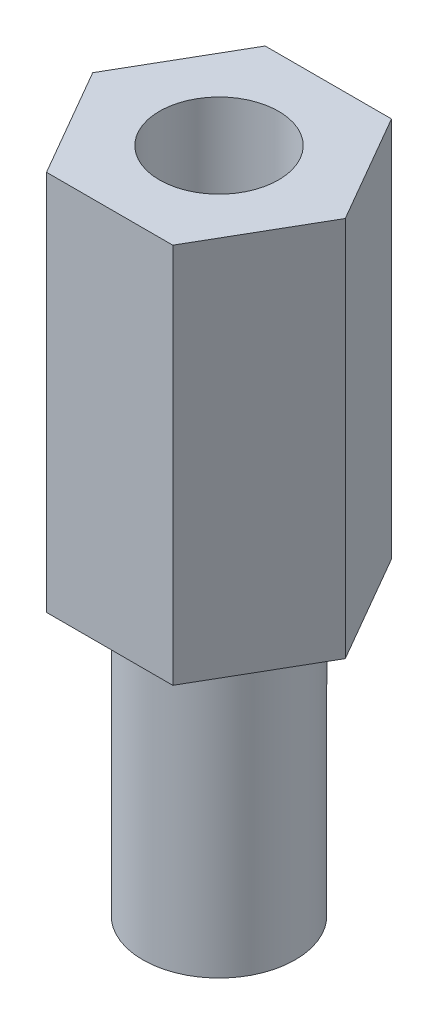
ISO-10303-21;
HEADER;
FILE_DESCRIPTION(('STEP AP214'),'2;1');
FILE_NAME('part.step','',(''),(''),'','','');
FILE_SCHEMA(('AUTOMOTIVE_DESIGN { 1 0 10303 214 1 1 1 1 }'));
ENDSEC;
DATA;
#1=APPLICATION_CONTEXT('core data for automotive mechanical design processes');
#2=APPLICATION_PROTOCOL_DEFINITION('international standard','automotive_design',2000,#1);
#3=PRODUCT_CONTEXT('',#1,'mechanical');
#4=PRODUCT('Part','Part','',(#3));
#5=PRODUCT_RELATED_PRODUCT_CATEGORY('part','',(#4));
#6=PRODUCT_DEFINITION_FORMATION('','',#4);
#7=PRODUCT_DEFINITION_CONTEXT('part definition',#1,'design');
#8=PRODUCT_DEFINITION('design','',#6,#7);
#9=PRODUCT_DEFINITION_SHAPE('','',#8);
#10=(LENGTH_UNIT() NAMED_UNIT(*) SI_UNIT(.MILLI.,.METRE.));
#11=(NAMED_UNIT(*) PLANE_ANGLE_UNIT() SI_UNIT($,.RADIAN.));
#12=(NAMED_UNIT(*) SI_UNIT($,.STERADIAN.) SOLID_ANGLE_UNIT());
#13=UNCERTAINTY_MEASURE_WITH_UNIT(LENGTH_MEASURE(1.E-05),#10,'distance_accuracy_value','');
#14=(GEOMETRIC_REPRESENTATION_CONTEXT(3) GLOBAL_UNCERTAINTY_ASSIGNED_CONTEXT((#13)) GLOBAL_UNIT_ASSIGNED_CONTEXT((#10,
#11,#12)) REPRESENTATION_CONTEXT('',''));
#15=CARTESIAN_POINT('',(0.,0.,0.));
#16=DIRECTION('',(0.,0.,1.));
#17=DIRECTION('',(1.,0.,0.));
#18=AXIS2_PLACEMENT_3D('',#15,#16,#17);
#19=CARTESIAN_POINT('',(-1.325,8.,2.29496732002876));
#20=DIRECTION('',(0.,0.,-1.));
#21=DIRECTION('',(-1.,0.,0.));
#22=AXIS2_PLACEMENT_3D('',#19,#20,#21);
#23=PLANE('',#22);
#24=DIRECTION('',(1.,0.,0.));
#25=VECTOR('',#24,1.);
#26=CARTESIAN_POINT('',(-1.325,0.,2.29496732002876));
#27=LINE('',#26,#25);
#28=CARTESIAN_POINT('',(-1.325,0.,2.29496732002876));
#29=VERTEX_POINT('',#28);
#30=CARTESIAN_POINT('',(1.325,0.,2.29496732002876));
#31=VERTEX_POINT('',#30);
#32=EDGE_CURVE('E121',#29,#31,#27,.T.);
#33=ORIENTED_EDGE('',*,*,#32,.T.);
#34=DIRECTION('',(0.,-1.,0.));
#35=VECTOR('',#34,1.);
#36=CARTESIAN_POINT('',(1.325,8.,2.29496732002876));
#37=LINE('',#36,#35);
#38=CARTESIAN_POINT('',(1.325,8.,2.29496732002876));
#39=VERTEX_POINT('',#38);
#40=EDGE_CURVE('E44',#39,#31,#37,.T.);
#41=ORIENTED_EDGE('',*,*,#40,.F.);
#42=DIRECTION('',(1.,0.,0.));
#43=VECTOR('',#42,1.);
#44=CARTESIAN_POINT('',(-1.325,8.,2.29496732002876));
#45=LINE('',#44,#43);
#46=CARTESIAN_POINT('',(-1.325,8.,2.29496732002876));
#47=VERTEX_POINT('',#46);
#48=EDGE_CURVE('E132',#47,#39,#45,.T.);
#49=ORIENTED_EDGE('',*,*,#48,.F.);
#50=DIRECTION('',(0.,-1.,0.));
#51=VECTOR('',#50,1.);
#52=CARTESIAN_POINT('',(-1.325,8.,2.29496732002876));
#53=LINE('',#52,#51);
#54=EDGE_CURVE('E117',#47,#29,#53,.T.);
#55=ORIENTED_EDGE('',*,*,#54,.T.);
#56=EDGE_LOOP('',(#33,#41,#49,#55));
#57=FACE_BOUND('',#56,.T.);
#58=ADVANCED_FACE('F36',(#57),#23,.F.);
#59=CARTESIAN_POINT('',(1.325,8.,2.29496732002876));
#60=DIRECTION('',(-0.866025403784439,0.,-0.5));
#61=DIRECTION('',(-0.5,0.,0.866025403784439));
#62=AXIS2_PLACEMENT_3D('',#59,#60,#61);
#63=PLANE('',#62);
#64=DIRECTION('',(0.5,0.,-0.866025403784439));
#65=VECTOR('',#64,1.);
#66=CARTESIAN_POINT('',(1.325,0.,2.29496732002876));
#67=LINE('',#66,#65);
#68=CARTESIAN_POINT('',(2.65,0.,0.));
#69=VERTEX_POINT('',#68);
#70=EDGE_CURVE('E124',#31,#69,#67,.T.);
#71=ORIENTED_EDGE('',*,*,#70,.T.);
#72=DIRECTION('',(0.,-1.,0.));
#73=VECTOR('',#72,1.);
#74=CARTESIAN_POINT('',(2.65,8.,0.));
#75=LINE('',#74,#73);
#76=CARTESIAN_POINT('',(2.65,8.,0.));
#77=VERTEX_POINT('',#76);
#78=EDGE_CURVE('E136',#77,#69,#75,.T.);
#79=ORIENTED_EDGE('',*,*,#78,.F.);
#80=DIRECTION('',(0.5,0.,-0.866025403784439));
#81=VECTOR('',#80,1.);
#82=CARTESIAN_POINT('',(1.325,8.,2.29496732002876));
#83=LINE('',#82,#81);
#84=EDGE_CURVE('E90',#39,#77,#83,.T.);
#85=ORIENTED_EDGE('',*,*,#84,.F.);
#86=ORIENTED_EDGE('',*,*,#40,.T.);
#87=EDGE_LOOP('',(#71,#79,#85,#86));
#88=FACE_BOUND('',#87,.T.);
#89=ADVANCED_FACE('F139',(#88),#63,.F.);
#90=CARTESIAN_POINT('',(2.65,8.,0.));
#91=DIRECTION('',(-0.866025403784439,0.,0.5));
#92=DIRECTION('',(0.5,0.,0.866025403784439));
#93=AXIS2_PLACEMENT_3D('',#90,#91,#92);
#94=PLANE('',#93);
#95=DIRECTION('',(-0.5,0.,-0.866025403784439));
#96=VECTOR('',#95,1.);
#97=CARTESIAN_POINT('',(2.65,0.,0.));
#98=LINE('',#97,#96);
#99=CARTESIAN_POINT('',(1.325,0.,-2.29496732002876));
#100=VERTEX_POINT('',#99);
#101=EDGE_CURVE('E127',#69,#100,#98,.T.);
#102=ORIENTED_EDGE('',*,*,#101,.T.);
#103=DIRECTION('',(0.,-1.,0.));
#104=VECTOR('',#103,1.);
#105=CARTESIAN_POINT('',(1.325,8.,-2.29496732002876));
#106=LINE('',#105,#104);
#107=CARTESIAN_POINT('',(1.325,8.,-2.29496732002876));
#108=VERTEX_POINT('',#107);
#109=EDGE_CURVE('E112',#108,#100,#106,.T.);
#110=ORIENTED_EDGE('',*,*,#109,.F.);
#111=DIRECTION('',(-0.5,0.,-0.866025403784439));
#112=VECTOR('',#111,1.);
#113=CARTESIAN_POINT('',(2.65,8.,0.));
#114=LINE('',#113,#112);
#115=EDGE_CURVE('E103',#77,#108,#114,.T.);
#116=ORIENTED_EDGE('',*,*,#115,.F.);
#117=ORIENTED_EDGE('',*,*,#78,.T.);
#118=EDGE_LOOP('',(#102,#110,#116,#117));
#119=FACE_BOUND('',#118,.T.);
#120=ADVANCED_FACE('F147',(#119),#94,.F.);
#121=CARTESIAN_POINT('',(1.325,8.,-2.29496732002876));
#122=DIRECTION('',(0.,0.,1.));
#123=DIRECTION('',(1.,0.,0.));
#124=AXIS2_PLACEMENT_3D('',#121,#122,#123);
#125=PLANE('',#124);
#126=DIRECTION('',(-1.,0.,0.));
#127=VECTOR('',#126,1.);
#128=CARTESIAN_POINT('',(1.325,0.,-2.29496732002876));
#129=LINE('',#128,#127);
#130=CARTESIAN_POINT('',(-1.325,0.,-2.29496732002876));
#131=VERTEX_POINT('',#130);
#132=EDGE_CURVE('E111',#100,#131,#129,.T.);
#133=ORIENTED_EDGE('',*,*,#132,.T.);
#134=DIRECTION('',(0.,-1.,0.));
#135=VECTOR('',#134,1.);
#136=CARTESIAN_POINT('',(-1.325,8.,-2.29496732002876));
#137=LINE('',#136,#135);
#138=CARTESIAN_POINT('',(-1.325,8.,-2.29496732002876));
#139=VERTEX_POINT('',#138);
#140=EDGE_CURVE('E108',#139,#131,#137,.T.);
#141=ORIENTED_EDGE('',*,*,#140,.F.);
#142=DIRECTION('',(-1.,0.,0.));
#143=VECTOR('',#142,1.);
#144=CARTESIAN_POINT('',(1.325,8.,-2.29496732002876));
#145=LINE('',#144,#143);
#146=EDGE_CURVE('E97',#108,#139,#145,.T.);
#147=ORIENTED_EDGE('',*,*,#146,.F.);
#148=ORIENTED_EDGE('',*,*,#109,.T.);
#149=EDGE_LOOP('',(#133,#141,#147,#148));
#150=FACE_BOUND('',#149,.T.);
#151=ADVANCED_FACE('F109',(#150),#125,.F.);
#152=CARTESIAN_POINT('',(-1.325,8.,-2.29496732002876));
#153=DIRECTION('',(0.866025403784439,0.,0.5));
#154=DIRECTION('',(0.5,0.,-0.866025403784439));
#155=AXIS2_PLACEMENT_3D('',#152,#153,#154);
#156=PLANE('',#155);
#157=DIRECTION('',(-0.5,0.,0.866025403784439));
#158=VECTOR('',#157,1.);
#159=CARTESIAN_POINT('',(-1.325,0.,-2.29496732002876));
#160=LINE('',#159,#158);
#161=CARTESIAN_POINT('',(-2.65,0.,0.));
#162=VERTEX_POINT('',#161);
#163=EDGE_CURVE('E75',#131,#162,#160,.T.);
#164=ORIENTED_EDGE('',*,*,#163,.T.);
#165=DIRECTION('',(0.,-1.,0.));
#166=VECTOR('',#165,1.);
#167=CARTESIAN_POINT('',(-2.65,8.,0.));
#168=LINE('',#167,#166);
#169=CARTESIAN_POINT('',(-2.65,8.,0.));
#170=VERTEX_POINT('',#169);
#171=EDGE_CURVE('E113',#170,#162,#168,.T.);
#172=ORIENTED_EDGE('',*,*,#171,.F.);
#173=DIRECTION('',(-0.5,0.,0.866025403784439));
#174=VECTOR('',#173,1.);
#175=CARTESIAN_POINT('',(-1.325,8.,-2.29496732002876));
#176=LINE('',#175,#174);
#177=EDGE_CURVE('E101',#139,#170,#176,.T.);
#178=ORIENTED_EDGE('',*,*,#177,.F.);
#179=ORIENTED_EDGE('',*,*,#140,.T.);
#180=EDGE_LOOP('',(#164,#172,#178,#179));
#181=FACE_BOUND('',#180,.T.);
#182=ADVANCED_FACE('F115',(#181),#156,.F.);
#183=CARTESIAN_POINT('',(-2.65,8.,0.));
#184=DIRECTION('',(0.866025403784439,0.,-0.5));
#185=DIRECTION('',(-0.5,0.,-0.866025403784439));
#186=AXIS2_PLACEMENT_3D('',#183,#184,#185);
#187=PLANE('',#186);
#188=DIRECTION('',(0.5,0.,0.866025403784439));
#189=VECTOR('',#188,1.);
#190=CARTESIAN_POINT('',(-2.65,0.,0.));
#191=LINE('',#190,#189);
#192=EDGE_CURVE('E81',#162,#29,#191,.T.);
#193=ORIENTED_EDGE('',*,*,#192,.T.);
#194=ORIENTED_EDGE('',*,*,#54,.F.);
#195=DIRECTION('',(0.5,0.,0.866025403784439));
#196=VECTOR('',#195,1.);
#197=CARTESIAN_POINT('',(-2.65,8.,0.));
#198=LINE('',#197,#196);
#199=EDGE_CURVE('E52',#170,#47,#198,.T.);
#200=ORIENTED_EDGE('',*,*,#199,.F.);
#201=ORIENTED_EDGE('',*,*,#171,.T.);
#202=EDGE_LOOP('',(#193,#194,#200,#201));
#203=FACE_BOUND('',#202,.T.);
#204=ADVANCED_FACE('F170',(#203),#187,.F.);
#205=CARTESIAN_POINT('',(0.,8.,0.));
#206=DIRECTION('',(0.,1.,0.));
#207=DIRECTION('',(0.,0.,1.));
#208=AXIS2_PLACEMENT_3D('',#205,#206,#207);
#209=PLANE('',#208);
#210=CARTESIAN_POINT('',(0.,8.,0.));
#211=DIRECTION('',(0.,1.,0.));
#212=DIRECTION('',(0.,0.,1.));
#213=AXIS2_PLACEMENT_3D('',#210,#211,#212);
#214=CIRCLE('',#213,1.25);
#215=CARTESIAN_POINT('',(0.,8.,1.25));
#216=VERTEX_POINT('',#215);
#217=EDGE_CURVE('E154',#216,#216,#214,.T.);
#218=ORIENTED_EDGE('',*,*,#217,.F.);
#219=EDGE_LOOP('',(#218));
#220=FACE_BOUND('',#219,.T.);
#221=ORIENTED_EDGE('',*,*,#48,.T.);
#222=ORIENTED_EDGE('',*,*,#84,.T.);
#223=ORIENTED_EDGE('',*,*,#115,.T.);
#224=ORIENTED_EDGE('',*,*,#146,.T.);
#225=ORIENTED_EDGE('',*,*,#177,.T.);
#226=ORIENTED_EDGE('',*,*,#199,.T.);
#227=EDGE_LOOP('',(#221,#222,#223,#224,#225,#226));
#228=FACE_BOUND('',#227,.T.);
#229=ADVANCED_FACE('F99',(#220,#228),#209,.T.);
#230=CARTESIAN_POINT('',(0.,0.,0.));
#231=DIRECTION('',(0.,1.,0.));
#232=DIRECTION('',(0.,0.,1.));
#233=AXIS2_PLACEMENT_3D('',#230,#231,#232);
#234=PLANE('',#233);
#235=CARTESIAN_POINT('',(0.,0.,0.));
#236=DIRECTION('',(0.,1.,0.));
#237=DIRECTION('',(0.,0.,1.));
#238=AXIS2_PLACEMENT_3D('',#235,#236,#237);
#239=CIRCLE('',#238,1.6);
#240=CARTESIAN_POINT('',(0.,0.,1.6));
#241=VERTEX_POINT('',#240);
#242=EDGE_CURVE('E11',#241,#241,#239,.F.);
#243=ORIENTED_EDGE('',*,*,#242,.F.);
#244=EDGE_LOOP('',(#243));
#245=FACE_BOUND('',#244,.T.);
#246=ORIENTED_EDGE('',*,*,#32,.F.);
#247=ORIENTED_EDGE('',*,*,#192,.F.);
#248=ORIENTED_EDGE('',*,*,#163,.F.);
#249=ORIENTED_EDGE('',*,*,#132,.F.);
#250=ORIENTED_EDGE('',*,*,#101,.F.);
#251=ORIENTED_EDGE('',*,*,#70,.F.);
#252=EDGE_LOOP('',(#246,#247,#248,#249,#250,#251));
#253=FACE_BOUND('',#252,.T.);
#254=ADVANCED_FACE('F144',(#245,#253),#234,.F.);
#255=CARTESIAN_POINT('',(0.,-6.,0.));
#256=DIRECTION('',(0.,1.,0.));
#257=DIRECTION('',(0.,0.,1.));
#258=AXIS2_PLACEMENT_3D('',#255,#256,#257);
#259=CYLINDRICAL_SURFACE('',#258,1.6);
#260=CARTESIAN_POINT('',(0.,-6.,0.));
#261=DIRECTION('',(0.,-1.,0.));
#262=DIRECTION('',(0.,0.,-1.));
#263=AXIS2_PLACEMENT_3D('',#260,#261,#262);
#264=CIRCLE('',#263,1.6);
#265=CARTESIAN_POINT('',(0.,-6.,-1.6));
#266=VERTEX_POINT('',#265);
#267=EDGE_CURVE('E125',#266,#266,#264,.T.);
#268=ORIENTED_EDGE('',*,*,#267,.F.);
#269=EDGE_LOOP('',(#268));
#270=FACE_BOUND('',#269,.T.);
#271=ORIENTED_EDGE('',*,*,#242,.T.);
#272=EDGE_LOOP('',(#271));
#273=FACE_BOUND('',#272,.T.);
#274=ADVANCED_FACE('F176',(#270,#273),#259,.T.);
#275=CARTESIAN_POINT('',(0.,-6.,0.));
#276=DIRECTION('',(0.,-1.,0.));
#277=DIRECTION('',(0.,0.,-1.));
#278=AXIS2_PLACEMENT_3D('',#275,#276,#277);
#279=PLANE('',#278);
#280=ORIENTED_EDGE('',*,*,#267,.T.);
#281=EDGE_LOOP('',(#280));
#282=FACE_BOUND('',#281,.T.);
#283=ADVANCED_FACE('F165',(#282),#279,.T.);
#284=CARTESIAN_POINT('',(0.,2.,0.));
#285=DIRECTION('',(0.,1.,0.));
#286=DIRECTION('',(0.,0.,1.));
#287=AXIS2_PLACEMENT_3D('',#284,#285,#286);
#288=CYLINDRICAL_SURFACE('',#287,1.25);
#289=CARTESIAN_POINT('',(0.,2.,0.));
#290=DIRECTION('',(0.,1.,0.));
#291=DIRECTION('',(0.,0.,1.));
#292=AXIS2_PLACEMENT_3D('',#289,#290,#291);
#293=CIRCLE('',#292,1.25);
#294=CARTESIAN_POINT('',(0.,2.,1.25));
#295=VERTEX_POINT('',#294);
#296=EDGE_CURVE('E153',#295,#295,#293,.T.);
#297=ORIENTED_EDGE('',*,*,#296,.F.);
#298=EDGE_LOOP('',(#297));
#299=FACE_BOUND('',#298,.T.);
#300=ORIENTED_EDGE('',*,*,#217,.T.);
#301=EDGE_LOOP('',(#300));
#302=FACE_BOUND('',#301,.T.);
#303=ADVANCED_FACE('F162',(#299,#302),#288,.F.);
#304=CARTESIAN_POINT('',(0.,2.,0.));
#305=DIRECTION('',(0.,1.,0.));
#306=DIRECTION('',(0.,0.,1.));
#307=AXIS2_PLACEMENT_3D('',#304,#305,#306);
#308=PLANE('',#307);
#309=ORIENTED_EDGE('',*,*,#296,.T.);
#310=EDGE_LOOP('',(#309));
#311=FACE_BOUND('',#310,.T.);
#312=ADVANCED_FACE('F160',(#311),#308,.T.);
#313=CLOSED_SHELL('',(#58,#89,#120,#151,#182,#204,#229,#254,#274,#283,#303,#312));
#314=MANIFOLD_SOLID_BREP('B2',#313);
#315=ADVANCED_BREP_SHAPE_REPRESENTATION('',(#18,#314),#14);
#316=SHAPE_DEFINITION_REPRESENTATION(#9,#315);
ENDSEC;
END-ISO-10303-21;
